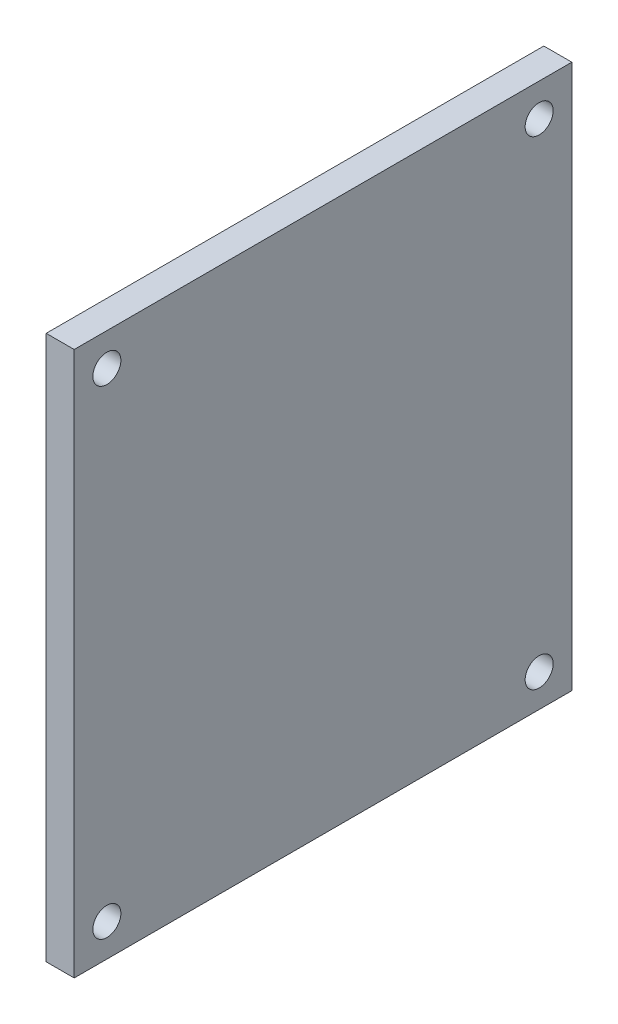
ISO-10303-21;
HEADER;
FILE_DESCRIPTION(('STEP AP214'),'2;1');
FILE_NAME('part.step','',(''),(''),'','','');
FILE_SCHEMA(('AUTOMOTIVE_DESIGN { 1 0 10303 214 1 1 1 1 }'));
ENDSEC;
DATA;
#1=APPLICATION_CONTEXT('core data for automotive mechanical design processes');
#2=APPLICATION_PROTOCOL_DEFINITION('international standard','automotive_design',2000,#1);
#3=PRODUCT_CONTEXT('',#1,'mechanical');
#4=PRODUCT('Part','Part','',(#3));
#5=PRODUCT_RELATED_PRODUCT_CATEGORY('part','',(#4));
#6=PRODUCT_DEFINITION_FORMATION('','',#4);
#7=PRODUCT_DEFINITION_CONTEXT('part definition',#1,'design');
#8=PRODUCT_DEFINITION('design','',#6,#7);
#9=PRODUCT_DEFINITION_SHAPE('','',#8);
#10=(LENGTH_UNIT() NAMED_UNIT(*) SI_UNIT(.MILLI.,.METRE.));
#11=(NAMED_UNIT(*) PLANE_ANGLE_UNIT() SI_UNIT($,.RADIAN.));
#12=(NAMED_UNIT(*) SI_UNIT($,.STERADIAN.) SOLID_ANGLE_UNIT());
#13=UNCERTAINTY_MEASURE_WITH_UNIT(LENGTH_MEASURE(1.E-05),#10,'distance_accuracy_value','');
#14=(GEOMETRIC_REPRESENTATION_CONTEXT(3) GLOBAL_UNCERTAINTY_ASSIGNED_CONTEXT((#13)) GLOBAL_UNIT_ASSIGNED_CONTEXT((#10,
#11,#12)) REPRESENTATION_CONTEXT('',''));
#15=CARTESIAN_POINT('',(0.,0.,0.));
#16=DIRECTION('',(0.,0.,1.));
#17=DIRECTION('',(1.,0.,0.));
#18=AXIS2_PLACEMENT_3D('',#15,#16,#17);
#19=CARTESIAN_POINT('',(3.,0.,0.));
#20=DIRECTION('',(-1.,0.,0.));
#21=DIRECTION('',(0.,0.,1.));
#22=AXIS2_PLACEMENT_3D('',#19,#20,#21);
#23=PLANE('',#22);
#24=CARTESIAN_POINT('',(3.,54.8,-49.8));
#25=DIRECTION('',(1.,0.,0.));
#26=DIRECTION('',(0.,0.,-1.));
#27=AXIS2_PLACEMENT_3D('',#24,#25,#26);
#28=CIRCLE('',#27,1.49999999999999);
#29=CARTESIAN_POINT('',(3.,54.8,-51.3));
#30=VERTEX_POINT('',#29);
#31=EDGE_CURVE('E206',#30,#30,#28,.T.);
#32=ORIENTED_EDGE('',*,*,#31,.F.);
#33=EDGE_LOOP('',(#32));
#34=FACE_BOUND('',#33,.T.);
#35=DIRECTION('',(0.,1.,0.));
#36=VECTOR('',#35,1.);
#37=CARTESIAN_POINT('',(3.,0.,0.));
#38=LINE('',#37,#36);
#39=CARTESIAN_POINT('',(3.,0.,0.));
#40=VERTEX_POINT('',#39);
#41=CARTESIAN_POINT('',(3.,58.3,0.));
#42=VERTEX_POINT('',#41);
#43=EDGE_CURVE('E93',#40,#42,#38,.T.);
#44=ORIENTED_EDGE('',*,*,#43,.F.);
#45=DIRECTION('',(0.,0.,-1.));
#46=VECTOR('',#45,1.);
#47=CARTESIAN_POINT('',(3.,0.,0.));
#48=LINE('',#47,#46);
#49=CARTESIAN_POINT('',(3.,0.,-53.3));
#50=VERTEX_POINT('',#49);
#51=EDGE_CURVE('E83',#40,#50,#48,.T.);
#52=ORIENTED_EDGE('',*,*,#51,.T.);
#53=DIRECTION('',(0.,1.,0.));
#54=VECTOR('',#53,1.);
#55=CARTESIAN_POINT('',(3.,0.,-53.3));
#56=LINE('',#55,#54);
#57=CARTESIAN_POINT('',(3.,58.3,-53.3));
#58=VERTEX_POINT('',#57);
#59=EDGE_CURVE('E78',#50,#58,#56,.T.);
#60=ORIENTED_EDGE('',*,*,#59,.T.);
#61=DIRECTION('',(0.,0.,-1.));
#62=VECTOR('',#61,1.);
#63=CARTESIAN_POINT('',(3.,58.3,0.));
#64=LINE('',#63,#62);
#65=EDGE_CURVE('E82',#42,#58,#64,.T.);
#66=ORIENTED_EDGE('',*,*,#65,.F.);
#67=EDGE_LOOP('',(#44,#52,#60,#66));
#68=FACE_BOUND('',#67,.T.);
#69=CARTESIAN_POINT('',(3.,3.5,-3.5));
#70=DIRECTION('',(1.,0.,0.));
#71=DIRECTION('',(0.,0.,-1.));
#72=AXIS2_PLACEMENT_3D('',#69,#70,#71);
#73=CIRCLE('',#72,1.49999999999999);
#74=CARTESIAN_POINT('',(3.,3.5,-4.99999999999999));
#75=VERTEX_POINT('',#74);
#76=EDGE_CURVE('E221',#75,#75,#73,.T.);
#77=ORIENTED_EDGE('',*,*,#76,.F.);
#78=EDGE_LOOP('',(#77));
#79=FACE_BOUND('',#78,.T.);
#80=CARTESIAN_POINT('',(3.,3.5,-49.8));
#81=DIRECTION('',(1.,0.,0.));
#82=DIRECTION('',(0.,0.,-1.));
#83=AXIS2_PLACEMENT_3D('',#80,#81,#82);
#84=CIRCLE('',#83,1.49999999999999);
#85=CARTESIAN_POINT('',(3.,3.5,-51.3));
#86=VERTEX_POINT('',#85);
#87=EDGE_CURVE('E215',#86,#86,#84,.T.);
#88=ORIENTED_EDGE('',*,*,#87,.F.);
#89=EDGE_LOOP('',(#88));
#90=FACE_BOUND('',#89,.T.);
#91=CARTESIAN_POINT('',(3.,54.8,-3.5));
#92=DIRECTION('',(1.,0.,0.));
#93=DIRECTION('',(0.,0.,-1.));
#94=AXIS2_PLACEMENT_3D('',#91,#92,#93);
#95=CIRCLE('',#94,1.49999999999999);
#96=CARTESIAN_POINT('',(3.,54.8,-4.99999999999999));
#97=VERTEX_POINT('',#96);
#98=EDGE_CURVE('E202',#97,#97,#95,.T.);
#99=ORIENTED_EDGE('',*,*,#98,.F.);
#100=EDGE_LOOP('',(#99));
#101=FACE_BOUND('',#100,.T.);
#102=ADVANCED_FACE('F32',(#34,#68,#79,#90,#101),#23,.F.);
#103=CARTESIAN_POINT('',(3.,0.,0.));
#104=DIRECTION('',(0.,0.,1.));
#105=DIRECTION('',(1.,0.,0.));
#106=AXIS2_PLACEMENT_3D('',#103,#104,#105);
#107=PLANE('',#106);
#108=DIRECTION('',(0.,1.,0.));
#109=VECTOR('',#108,1.);
#110=CARTESIAN_POINT('',(0.,0.,0.));
#111=LINE('',#110,#109);
#112=CARTESIAN_POINT('',(0.,0.,0.));
#113=VERTEX_POINT('',#112);
#114=CARTESIAN_POINT('',(0.,58.3,0.));
#115=VERTEX_POINT('',#114);
#116=EDGE_CURVE('E99',#113,#115,#111,.T.);
#117=ORIENTED_EDGE('',*,*,#116,.F.);
#118=DIRECTION('',(-1.,0.,0.));
#119=VECTOR('',#118,1.);
#120=CARTESIAN_POINT('',(3.,0.,0.));
#121=LINE('',#120,#119);
#122=EDGE_CURVE('E11',#40,#113,#121,.T.);
#123=ORIENTED_EDGE('',*,*,#122,.F.);
#124=ORIENTED_EDGE('',*,*,#43,.T.);
#125=DIRECTION('',(-1.,0.,0.));
#126=VECTOR('',#125,1.);
#127=CARTESIAN_POINT('',(3.,58.3,0.));
#128=LINE('',#127,#126);
#129=EDGE_CURVE('E36',#42,#115,#128,.T.);
#130=ORIENTED_EDGE('',*,*,#129,.T.);
#131=EDGE_LOOP('',(#117,#123,#124,#130));
#132=FACE_BOUND('',#131,.T.);
#133=ADVANCED_FACE('F34',(#132),#107,.T.);
#134=CARTESIAN_POINT('',(3.,0.,0.));
#135=DIRECTION('',(0.,1.,0.));
#136=DIRECTION('',(0.,0.,1.));
#137=AXIS2_PLACEMENT_3D('',#134,#135,#136);
#138=PLANE('',#137);
#139=DIRECTION('',(0.,0.,-1.));
#140=VECTOR('',#139,1.);
#141=CARTESIAN_POINT('',(0.,0.,0.));
#142=LINE('',#141,#140);
#143=CARTESIAN_POINT('',(0.,0.,-53.3));
#144=VERTEX_POINT('',#143);
#145=EDGE_CURVE('E66',#113,#144,#142,.T.);
#146=ORIENTED_EDGE('',*,*,#145,.T.);
#147=DIRECTION('',(-1.,0.,0.));
#148=VECTOR('',#147,1.);
#149=CARTESIAN_POINT('',(3.,0.,-53.3));
#150=LINE('',#149,#148);
#151=EDGE_CURVE('E42',#50,#144,#150,.T.);
#152=ORIENTED_EDGE('',*,*,#151,.F.);
#153=ORIENTED_EDGE('',*,*,#51,.F.);
#154=ORIENTED_EDGE('',*,*,#122,.T.);
#155=EDGE_LOOP('',(#146,#152,#153,#154));
#156=FACE_BOUND('',#155,.T.);
#157=ADVANCED_FACE('F110',(#156),#138,.F.);
#158=CARTESIAN_POINT('',(3.,0.,-53.3));
#159=DIRECTION('',(0.,0.,1.));
#160=DIRECTION('',(1.,0.,0.));
#161=AXIS2_PLACEMENT_3D('',#158,#159,#160);
#162=PLANE('',#161);
#163=DIRECTION('',(0.,1.,0.));
#164=VECTOR('',#163,1.);
#165=CARTESIAN_POINT('',(0.,0.,-53.3));
#166=LINE('',#165,#164);
#167=CARTESIAN_POINT('',(0.,58.3,-53.3));
#168=VERTEX_POINT('',#167);
#169=EDGE_CURVE('E90',#144,#168,#166,.T.);
#170=ORIENTED_EDGE('',*,*,#169,.T.);
#171=DIRECTION('',(-1.,0.,0.));
#172=VECTOR('',#171,1.);
#173=CARTESIAN_POINT('',(3.,58.3,-53.3));
#174=LINE('',#173,#172);
#175=EDGE_CURVE('E87',#58,#168,#174,.T.);
#176=ORIENTED_EDGE('',*,*,#175,.F.);
#177=ORIENTED_EDGE('',*,*,#59,.F.);
#178=ORIENTED_EDGE('',*,*,#151,.T.);
#179=EDGE_LOOP('',(#170,#176,#177,#178));
#180=FACE_BOUND('',#179,.T.);
#181=ADVANCED_FACE('F88',(#180),#162,.F.);
#182=CARTESIAN_POINT('',(3.,58.3,0.));
#183=DIRECTION('',(0.,1.,0.));
#184=DIRECTION('',(0.,0.,1.));
#185=AXIS2_PLACEMENT_3D('',#182,#183,#184);
#186=PLANE('',#185);
#187=DIRECTION('',(0.,0.,-1.));
#188=VECTOR('',#187,1.);
#189=CARTESIAN_POINT('',(0.,58.3,0.));
#190=LINE('',#189,#188);
#191=EDGE_CURVE('E102',#115,#168,#190,.T.);
#192=ORIENTED_EDGE('',*,*,#191,.F.);
#193=ORIENTED_EDGE('',*,*,#129,.F.);
#194=ORIENTED_EDGE('',*,*,#65,.T.);
#195=ORIENTED_EDGE('',*,*,#175,.T.);
#196=EDGE_LOOP('',(#192,#193,#194,#195));
#197=FACE_BOUND('',#196,.T.);
#198=ADVANCED_FACE('F92',(#197),#186,.T.);
#199=CARTESIAN_POINT('',(0.,0.,0.));
#200=DIRECTION('',(-1.,0.,0.));
#201=DIRECTION('',(0.,0.,1.));
#202=AXIS2_PLACEMENT_3D('',#199,#200,#201);
#203=PLANE('',#202);
#204=CARTESIAN_POINT('',(0.,54.8,-3.5));
#205=DIRECTION('',(-1.,0.,0.));
#206=DIRECTION('',(0.,0.,1.));
#207=AXIS2_PLACEMENT_3D('',#204,#205,#206);
#208=CIRCLE('',#207,1.49999999999999);
#209=CARTESIAN_POINT('',(0.,54.8,-2.00000000000001));
#210=VERTEX_POINT('',#209);
#211=EDGE_CURVE('E205',#210,#210,#208,.T.);
#212=ORIENTED_EDGE('',*,*,#211,.F.);
#213=EDGE_LOOP('',(#212));
#214=FACE_BOUND('',#213,.T.);
#215=CARTESIAN_POINT('',(0.,54.8,-49.8));
#216=DIRECTION('',(-1.,0.,0.));
#217=DIRECTION('',(0.,0.,1.));
#218=AXIS2_PLACEMENT_3D('',#215,#216,#217);
#219=CIRCLE('',#218,1.49999999999999);
#220=CARTESIAN_POINT('',(0.,54.8,-48.3));
#221=VERTEX_POINT('',#220);
#222=EDGE_CURVE('E209',#221,#221,#219,.T.);
#223=ORIENTED_EDGE('',*,*,#222,.F.);
#224=EDGE_LOOP('',(#223));
#225=FACE_BOUND('',#224,.T.);
#226=CARTESIAN_POINT('',(0.,3.5,-49.8));
#227=DIRECTION('',(-1.,0.,0.));
#228=DIRECTION('',(0.,0.,1.));
#229=AXIS2_PLACEMENT_3D('',#226,#227,#228);
#230=CIRCLE('',#229,1.49999999999999);
#231=CARTESIAN_POINT('',(0.,3.5,-48.3));
#232=VERTEX_POINT('',#231);
#233=EDGE_CURVE('E218',#232,#232,#230,.T.);
#234=ORIENTED_EDGE('',*,*,#233,.F.);
#235=EDGE_LOOP('',(#234));
#236=FACE_BOUND('',#235,.T.);
#237=CARTESIAN_POINT('',(0.,3.5,-3.5));
#238=DIRECTION('',(-1.,0.,0.));
#239=DIRECTION('',(0.,0.,1.));
#240=AXIS2_PLACEMENT_3D('',#237,#238,#239);
#241=CIRCLE('',#240,1.49999999999999);
#242=CARTESIAN_POINT('',(0.,3.5,-2.00000000000001));
#243=VERTEX_POINT('',#242);
#244=EDGE_CURVE('E103',#243,#243,#241,.T.);
#245=ORIENTED_EDGE('',*,*,#244,.F.);
#246=EDGE_LOOP('',(#245));
#247=FACE_BOUND('',#246,.T.);
#248=ORIENTED_EDGE('',*,*,#116,.T.);
#249=ORIENTED_EDGE('',*,*,#191,.T.);
#250=ORIENTED_EDGE('',*,*,#169,.F.);
#251=ORIENTED_EDGE('',*,*,#145,.F.);
#252=EDGE_LOOP('',(#248,#249,#250,#251));
#253=FACE_BOUND('',#252,.T.);
#254=ADVANCED_FACE('F108',(#214,#225,#236,#247,#253),#203,.T.);
#255=CARTESIAN_POINT('',(3.,3.5,-3.5));
#256=DIRECTION('',(1.,0.,0.));
#257=DIRECTION('',(0.,0.,-1.));
#258=AXIS2_PLACEMENT_3D('',#255,#256,#257);
#259=CYLINDRICAL_SURFACE('',#258,1.49999999999999);
#260=ORIENTED_EDGE('',*,*,#76,.T.);
#261=EDGE_LOOP('',(#260));
#262=FACE_BOUND('',#261,.T.);
#263=ORIENTED_EDGE('',*,*,#244,.T.);
#264=EDGE_LOOP('',(#263));
#265=FACE_BOUND('',#264,.T.);
#266=ADVANCED_FACE('F123',(#262,#265),#259,.F.);
#267=CARTESIAN_POINT('',(3.,3.5,-49.8));
#268=DIRECTION('',(1.,0.,0.));
#269=DIRECTION('',(0.,0.,-1.));
#270=AXIS2_PLACEMENT_3D('',#267,#268,#269);
#271=CYLINDRICAL_SURFACE('',#270,1.49999999999999);
#272=ORIENTED_EDGE('',*,*,#87,.T.);
#273=EDGE_LOOP('',(#272));
#274=FACE_BOUND('',#273,.T.);
#275=ORIENTED_EDGE('',*,*,#233,.T.);
#276=EDGE_LOOP('',(#275));
#277=FACE_BOUND('',#276,.T.);
#278=ADVANCED_FACE('F144',(#274,#277),#271,.F.);
#279=CARTESIAN_POINT('',(3.,54.8,-49.8));
#280=DIRECTION('',(1.,0.,0.));
#281=DIRECTION('',(0.,0.,-1.));
#282=AXIS2_PLACEMENT_3D('',#279,#280,#281);
#283=CYLINDRICAL_SURFACE('',#282,1.49999999999999);
#284=ORIENTED_EDGE('',*,*,#31,.T.);
#285=EDGE_LOOP('',(#284));
#286=FACE_BOUND('',#285,.T.);
#287=ORIENTED_EDGE('',*,*,#222,.T.);
#288=EDGE_LOOP('',(#287));
#289=FACE_BOUND('',#288,.T.);
#290=ADVANCED_FACE('F151',(#286,#289),#283,.F.);
#291=CARTESIAN_POINT('',(3.,54.8,-3.5));
#292=DIRECTION('',(1.,0.,0.));
#293=DIRECTION('',(0.,0.,-1.));
#294=AXIS2_PLACEMENT_3D('',#291,#292,#293);
#295=CYLINDRICAL_SURFACE('',#294,1.49999999999999);
#296=ORIENTED_EDGE('',*,*,#98,.T.);
#297=EDGE_LOOP('',(#296));
#298=FACE_BOUND('',#297,.T.);
#299=ORIENTED_EDGE('',*,*,#211,.T.);
#300=EDGE_LOOP('',(#299));
#301=FACE_BOUND('',#300,.T.);
#302=ADVANCED_FACE('F158',(#298,#301),#295,.F.);
#303=CLOSED_SHELL('',(#102,#133,#157,#181,#198,#254,#266,#278,#290,#302));
#304=MANIFOLD_SOLID_BREP('B2',#303);
#305=ADVANCED_BREP_SHAPE_REPRESENTATION('',(#18,#304),#14);
#306=SHAPE_DEFINITION_REPRESENTATION(#9,#305);
ENDSEC;
END-ISO-10303-21;
